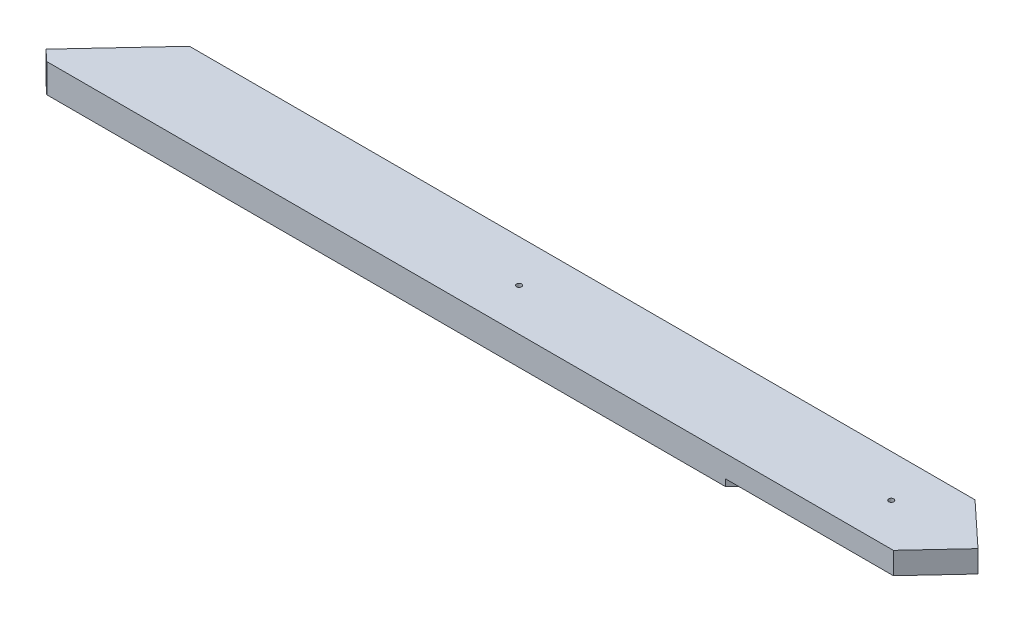
ISO-10303-21;
HEADER;
FILE_DESCRIPTION(('STEP AP214'),'2;1');
FILE_NAME('part.step','',(''),(''),'','','');
FILE_SCHEMA(('AUTOMOTIVE_DESIGN { 1 0 10303 214 1 1 1 1 }'));
ENDSEC;
DATA;
#1=APPLICATION_CONTEXT('core data for automotive mechanical design processes');
#2=APPLICATION_PROTOCOL_DEFINITION('international standard','automotive_design',2000,#1);
#3=PRODUCT_CONTEXT('',#1,'mechanical');
#4=PRODUCT('Part','Part','',(#3));
#5=PRODUCT_RELATED_PRODUCT_CATEGORY('part','',(#4));
#6=PRODUCT_DEFINITION_FORMATION('','',#4);
#7=PRODUCT_DEFINITION_CONTEXT('part definition',#1,'design');
#8=PRODUCT_DEFINITION('design','',#6,#7);
#9=PRODUCT_DEFINITION_SHAPE('','',#8);
#10=(LENGTH_UNIT() NAMED_UNIT(*) SI_UNIT(.MILLI.,.METRE.));
#11=(NAMED_UNIT(*) PLANE_ANGLE_UNIT() SI_UNIT($,.RADIAN.));
#12=(NAMED_UNIT(*) SI_UNIT($,.STERADIAN.) SOLID_ANGLE_UNIT());
#13=UNCERTAINTY_MEASURE_WITH_UNIT(LENGTH_MEASURE(1.E-05),#10,'distance_accuracy_value','');
#14=(GEOMETRIC_REPRESENTATION_CONTEXT(3) GLOBAL_UNCERTAINTY_ASSIGNED_CONTEXT((#13)) GLOBAL_UNIT_ASSIGNED_CONTEXT((#10,
#11,#12)) REPRESENTATION_CONTEXT('',''));
#15=CARTESIAN_POINT('',(0.,0.,0.));
#16=DIRECTION('',(0.,0.,1.));
#17=DIRECTION('',(1.,0.,0.));
#18=AXIS2_PLACEMENT_3D('',#15,#16,#17);
#19=CARTESIAN_POINT('',(440.,0.,0.));
#20=DIRECTION('',(0.,1.,0.));
#21=DIRECTION('',(0.,0.,1.));
#22=AXIS2_PLACEMENT_3D('',#19,#20,#21);
#23=CYLINDRICAL_SURFACE('',#22,3.);
#24=CARTESIAN_POINT('',(440.,34.,0.));
#25=DIRECTION('',(0.,1.,0.));
#26=DIRECTION('',(0.,0.,1.));
#27=AXIS2_PLACEMENT_3D('',#24,#25,#26);
#28=CIRCLE('',#27,3.);
#29=CARTESIAN_POINT('',(440.,34.,3.));
#30=VERTEX_POINT('',#29);
#31=EDGE_CURVE('E133',#30,#30,#28,.T.);
#32=ORIENTED_EDGE('',*,*,#31,.T.);
#33=EDGE_LOOP('',(#32));
#34=FACE_BOUND('',#33,.T.);
#35=CARTESIAN_POINT('',(440.,8.,0.));
#36=DIRECTION('',(0.,-1.,0.));
#37=DIRECTION('',(0.,0.,-1.));
#38=AXIS2_PLACEMENT_3D('',#35,#36,#37);
#39=CIRCLE('',#38,3.);
#40=CARTESIAN_POINT('',(440.,8.,-3.));
#41=VERTEX_POINT('',#40);
#42=EDGE_CURVE('E109',#41,#41,#39,.F.);
#43=ORIENTED_EDGE('',*,*,#42,.F.);
#44=EDGE_LOOP('',(#43));
#45=FACE_BOUND('',#44,.T.);
#46=ADVANCED_FACE('F33',(#34,#45),#23,.F.);
#47=CARTESIAN_POINT('',(394.883300151054,0.,154.73897124015));
#48=DIRECTION('',(-0.731521679065049,0.,-0.681818181818182));
#49=DIRECTION('',(-0.681818181818182,0.,0.731521679065049));
#50=AXIS2_PLACEMENT_3D('',#47,#48,#49);
#51=PLANE('',#50);
#52=DIRECTION('',(-0.681818181818182,0.,0.731521679065049));
#53=VECTOR('',#52,1.);
#54=CARTESIAN_POINT('',(394.883300151054,8.,154.73897124015));
#55=LINE('',#54,#53);
#56=CARTESIAN_POINT('',(540.762594459489,8.,-1.77469935273544));
#57=VERTEX_POINT('',#56);
#58=CARTESIAN_POINT('',(492.505745227101,8.,50.));
#59=VERTEX_POINT('',#58);
#60=EDGE_CURVE('E173',#57,#59,#55,.T.);
#61=ORIENTED_EDGE('',*,*,#60,.F.);
#62=DIRECTION('',(0.,1.,0.));
#63=VECTOR('',#62,1.);
#64=CARTESIAN_POINT('',(540.762594459489,0.,-1.77469935273547));
#65=LINE('',#64,#63);
#66=CARTESIAN_POINT('',(540.762594459489,34.,-1.77469935273547));
#67=VERTEX_POINT('',#66);
#68=EDGE_CURVE('E143',#57,#67,#65,.T.);
#69=ORIENTED_EDGE('',*,*,#68,.T.);
#70=DIRECTION('',(-0.681818181818182,0.,0.731521679065049));
#71=VECTOR('',#70,1.);
#72=CARTESIAN_POINT('',(394.883300151054,34.,154.73897124015));
#73=LINE('',#72,#71);
#74=CARTESIAN_POINT('',(492.505745227101,34.,50.));
#75=VERTEX_POINT('',#74);
#76=EDGE_CURVE('E148',#67,#75,#73,.T.);
#77=ORIENTED_EDGE('',*,*,#76,.T.);
#78=DIRECTION('',(0.,1.,0.));
#79=VECTOR('',#78,1.);
#80=CARTESIAN_POINT('',(492.505745227102,34.,50.));
#81=LINE('',#80,#79);
#82=EDGE_CURVE('E138',#59,#75,#81,.T.);
#83=ORIENTED_EDGE('',*,*,#82,.F.);
#84=EDGE_LOOP('',(#61,#69,#77,#83));
#85=FACE_BOUND('',#84,.T.);
#86=ADVANCED_FACE('F189',(#85),#51,.F.);
#87=CARTESIAN_POINT('',(540.762594459489,0.,-1.77469935273547));
#88=DIRECTION('',(-0.681818181818181,0.,0.73152167906505));
#89=DIRECTION('',(0.73152167906505,0.,0.681818181818181));
#90=AXIS2_PLACEMENT_3D('',#87,#88,#89);
#91=PLANE('',#90);
#92=DIRECTION('',(0.73152167906505,0.,0.681818181818181));
#93=VECTOR('',#92,1.);
#94=CARTESIAN_POINT('',(540.762594459489,8.,-1.77469935273547));
#95=LINE('',#94,#93);
#96=CARTESIAN_POINT('',(489.02174353523,8.,-50.));
#97=VERTEX_POINT('',#96);
#98=EDGE_CURVE('E11',#97,#57,#95,.T.);
#99=ORIENTED_EDGE('',*,*,#98,.F.);
#100=DIRECTION('',(0.,-1.,0.));
#101=VECTOR('',#100,1.);
#102=CARTESIAN_POINT('',(489.02174353523,34.,-50.));
#103=LINE('',#102,#101);
#104=CARTESIAN_POINT('',(489.02174353523,34.,-50.));
#105=VERTEX_POINT('',#104);
#106=EDGE_CURVE('E140',#105,#97,#103,.T.);
#107=ORIENTED_EDGE('',*,*,#106,.F.);
#108=DIRECTION('',(0.73152167906505,0.,0.681818181818181));
#109=VECTOR('',#108,1.);
#110=CARTESIAN_POINT('',(540.762594459489,34.,-1.77469935273547));
#111=LINE('',#110,#109);
#112=EDGE_CURVE('E145',#105,#67,#111,.T.);
#113=ORIENTED_EDGE('',*,*,#112,.T.);
#114=ORIENTED_EDGE('',*,*,#68,.F.);
#115=EDGE_LOOP('',(#99,#107,#113,#114));
#116=FACE_BOUND('',#115,.T.);
#117=ADVANCED_FACE('F180',(#116),#91,.F.);
#118=CARTESIAN_POINT('',(-550.,34.,-50.));
#119=DIRECTION('',(0.,0.,1.));
#120=DIRECTION('',(1.,0.,0.));
#121=AXIS2_PLACEMENT_3D('',#118,#119,#120);
#122=PLANE('',#121);
#123=DIRECTION('',(1.,0.,0.));
#124=VECTOR('',#123,1.);
#125=CARTESIAN_POINT('',(-550.,8.,-50.));
#126=LINE('',#125,#124);
#127=CARTESIAN_POINT('',(387.494254772899,8.,-50.));
#128=VERTEX_POINT('',#127);
#129=EDGE_CURVE('E47',#128,#97,#126,.T.);
#130=ORIENTED_EDGE('',*,*,#129,.F.);
#131=DIRECTION('',(0.,-1.,0.));
#132=VECTOR('',#131,1.);
#133=CARTESIAN_POINT('',(387.494254772899,34.,-50.));
#134=LINE('',#133,#132);
#135=CARTESIAN_POINT('',(387.494254772899,0.,-50.));
#136=VERTEX_POINT('',#135);
#137=EDGE_CURVE('E108',#128,#136,#134,.T.);
#138=ORIENTED_EDGE('',*,*,#137,.T.);
#139=DIRECTION('',(-1.,0.,0.));
#140=VECTOR('',#139,1.);
#141=CARTESIAN_POINT('',(-550.,0.,-50.));
#142=LINE('',#141,#140);
#143=CARTESIAN_POINT('',(-439.548903774699,0.,-50.));
#144=VERTEX_POINT('',#143);
#145=EDGE_CURVE('E55',#136,#144,#142,.T.);
#146=ORIENTED_EDGE('',*,*,#145,.T.);
#147=DIRECTION('',(0.,-1.,0.));
#148=VECTOR('',#147,1.);
#149=CARTESIAN_POINT('',(-439.548903774699,34.,-50.));
#150=LINE('',#149,#148);
#151=CARTESIAN_POINT('',(-439.548903774699,34.,-50.));
#152=VERTEX_POINT('',#151);
#153=EDGE_CURVE('E153',#152,#144,#150,.T.);
#154=ORIENTED_EDGE('',*,*,#153,.F.);
#155=DIRECTION('',(-1.,0.,0.));
#156=VECTOR('',#155,1.);
#157=CARTESIAN_POINT('',(-550.,34.,-50.));
#158=LINE('',#157,#156);
#159=EDGE_CURVE('E122',#105,#152,#158,.T.);
#160=ORIENTED_EDGE('',*,*,#159,.F.);
#161=ORIENTED_EDGE('',*,*,#106,.T.);
#162=EDGE_LOOP('',(#130,#138,#146,#154,#160,#161));
#163=FACE_BOUND('',#162,.T.);
#164=ADVANCED_FACE('F35',(#163),#122,.F.);
#165=CARTESIAN_POINT('',(-550.,34.,50.));
#166=DIRECTION('',(0.,0.,-1.));
#167=DIRECTION('',(-1.,0.,0.));
#168=AXIS2_PLACEMENT_3D('',#165,#166,#167);
#169=PLANE('',#168);
#170=DIRECTION('',(1.,0.,0.));
#171=VECTOR('',#170,1.);
#172=CARTESIAN_POINT('',(-550.,0.,50.));
#173=LINE('',#172,#171);
#174=CARTESIAN_POINT('',(-508.259057511825,0.,50.));
#175=VERTEX_POINT('',#174);
#176=CARTESIAN_POINT('',(294.288789872718,0.,50.));
#177=VERTEX_POINT('',#176);
#178=EDGE_CURVE('E115',#175,#177,#173,.T.);
#179=ORIENTED_EDGE('',*,*,#178,.T.);
#180=DIRECTION('',(0.,1.,0.));
#181=VECTOR('',#180,1.);
#182=CARTESIAN_POINT('',(294.288789872719,34.,50.));
#183=LINE('',#182,#181);
#184=CARTESIAN_POINT('',(294.288789872718,8.,50.));
#185=VERTEX_POINT('',#184);
#186=EDGE_CURVE('E100',#177,#185,#183,.T.);
#187=ORIENTED_EDGE('',*,*,#186,.T.);
#188=DIRECTION('',(-1.,0.,0.));
#189=VECTOR('',#188,1.);
#190=CARTESIAN_POINT('',(-550.,8.,50.));
#191=LINE('',#190,#189);
#192=EDGE_CURVE('E171',#59,#185,#191,.T.);
#193=ORIENTED_EDGE('',*,*,#192,.F.);
#194=ORIENTED_EDGE('',*,*,#82,.T.);
#195=DIRECTION('',(1.,0.,0.));
#196=VECTOR('',#195,1.);
#197=CARTESIAN_POINT('',(-550.,34.,50.));
#198=LINE('',#197,#196);
#199=CARTESIAN_POINT('',(-508.259057511825,34.,50.));
#200=VERTEX_POINT('',#199);
#201=EDGE_CURVE('E41',#200,#75,#198,.T.);
#202=ORIENTED_EDGE('',*,*,#201,.F.);
#203=DIRECTION('',(0.,-1.,0.));
#204=VECTOR('',#203,1.);
#205=CARTESIAN_POINT('',(-508.259057511825,34.,50.));
#206=LINE('',#205,#204);
#207=EDGE_CURVE('E121',#200,#175,#206,.T.);
#208=ORIENTED_EDGE('',*,*,#207,.T.);
#209=EDGE_LOOP('',(#179,#187,#193,#194,#202,#208));
#210=FACE_BOUND('',#209,.T.);
#211=ADVANCED_FACE('F119',(#210),#169,.F.);
#212=CARTESIAN_POINT('',(0.,34.,0.));
#213=DIRECTION('',(0.,1.,0.));
#214=DIRECTION('',(0.,0.,1.));
#215=AXIS2_PLACEMENT_3D('',#212,#213,#214);
#216=PLANE('',#215);
#217=DIRECTION('',(0.731521679065048,0.,0.681818181818183));
#218=VECTOR('',#217,1.);
#219=CARTESIAN_POINT('',(-521.367085592881,34.,37.7826014878059));
#220=LINE('',#219,#218);
#221=CARTESIAN_POINT('',(-521.367085592881,34.,37.7826014878059));
#222=VERTEX_POINT('',#221);
#223=EDGE_CURVE('E155',#222,#200,#220,.T.);
#224=ORIENTED_EDGE('',*,*,#223,.T.);
#225=ORIENTED_EDGE('',*,*,#201,.T.);
#226=ORIENTED_EDGE('',*,*,#76,.F.);
#227=ORIENTED_EDGE('',*,*,#112,.F.);
#228=ORIENTED_EDGE('',*,*,#159,.T.);
#229=DIRECTION('',(-0.681818181818182,0.,0.731521679065049));
#230=VECTOR('',#229,1.);
#231=CARTESIAN_POINT('',(-439.548903774699,34.,-50.));
#232=LINE('',#231,#230);
#233=EDGE_CURVE('E159',#152,#222,#232,.T.);
#234=ORIENTED_EDGE('',*,*,#233,.T.);
#235=EDGE_LOOP('',(#224,#225,#226,#227,#228,#234));
#236=FACE_BOUND('',#235,.T.);
#237=ORIENTED_EDGE('',*,*,#31,.F.);
#238=EDGE_LOOP('',(#237));
#239=FACE_BOUND('',#238,.T.);
#240=CARTESIAN_POINT('',(0.,34.,0.));
#241=DIRECTION('',(0.,1.,0.));
#242=DIRECTION('',(0.,0.,1.));
#243=AXIS2_PLACEMENT_3D('',#240,#241,#242);
#244=CIRCLE('',#243,3.);
#245=CARTESIAN_POINT('',(0.,34.,3.));
#246=VERTEX_POINT('',#245);
#247=EDGE_CURVE('E130',#246,#246,#244,.T.);
#248=ORIENTED_EDGE('',*,*,#247,.F.);
#249=EDGE_LOOP('',(#248));
#250=FACE_BOUND('',#249,.T.);
#251=ADVANCED_FACE('F184',(#236,#239,#250),#216,.T.);
#252=CARTESIAN_POINT('',(0.,0.,0.));
#253=DIRECTION('',(0.,1.,0.));
#254=DIRECTION('',(0.,0.,1.));
#255=AXIS2_PLACEMENT_3D('',#252,#253,#254);
#256=PLANE('',#255);
#257=CARTESIAN_POINT('',(0.,0.,0.));
#258=DIRECTION('',(0.,1.,0.));
#259=DIRECTION('',(0.,0.,1.));
#260=AXIS2_PLACEMENT_3D('',#257,#258,#259);
#261=CIRCLE('',#260,3.);
#262=CARTESIAN_POINT('',(0.,0.,3.));
#263=VERTEX_POINT('',#262);
#264=EDGE_CURVE('E125',#263,#263,#261,.T.);
#265=ORIENTED_EDGE('',*,*,#264,.T.);
#266=EDGE_LOOP('',(#265));
#267=FACE_BOUND('',#266,.T.);
#268=ORIENTED_EDGE('',*,*,#145,.F.);
#269=DIRECTION('',(0.681818181818182,0.,-0.731521679065049));
#270=VECTOR('',#269,1.);
#271=CARTESIAN_POINT('',(457.659075479897,0.,-125.27972826716));
#272=LINE('',#271,#270);
#273=EDGE_CURVE('E103',#177,#136,#272,.T.);
#274=ORIENTED_EDGE('',*,*,#273,.F.);
#275=ORIENTED_EDGE('',*,*,#178,.F.);
#276=DIRECTION('',(0.731521679065048,0.,0.681818181818183));
#277=VECTOR('',#276,1.);
#278=CARTESIAN_POINT('',(-521.367085592881,0.,37.7826014878059));
#279=LINE('',#278,#277);
#280=CARTESIAN_POINT('',(-521.367085592881,0.,37.7826014878059));
#281=VERTEX_POINT('',#280);
#282=EDGE_CURVE('E157',#281,#175,#279,.T.);
#283=ORIENTED_EDGE('',*,*,#282,.F.);
#284=DIRECTION('',(-0.681818181818182,0.,0.731521679065049));
#285=VECTOR('',#284,1.);
#286=CARTESIAN_POINT('',(-439.548903774699,0.,-50.));
#287=LINE('',#286,#285);
#288=EDGE_CURVE('E160',#144,#281,#287,.T.);
#289=ORIENTED_EDGE('',*,*,#288,.F.);
#290=EDGE_LOOP('',(#268,#274,#275,#283,#289));
#291=FACE_BOUND('',#290,.T.);
#292=ADVANCED_FACE('F113',(#267,#291),#256,.F.);
#293=CARTESIAN_POINT('',(0.,0.,0.));
#294=DIRECTION('',(0.,1.,0.));
#295=DIRECTION('',(0.,0.,1.));
#296=AXIS2_PLACEMENT_3D('',#293,#294,#295);
#297=CYLINDRICAL_SURFACE('',#296,3.);
#298=ORIENTED_EDGE('',*,*,#264,.F.);
#299=EDGE_LOOP('',(#298));
#300=FACE_BOUND('',#299,.T.);
#301=ORIENTED_EDGE('',*,*,#247,.T.);
#302=EDGE_LOOP('',(#301));
#303=FACE_BOUND('',#302,.T.);
#304=ADVANCED_FACE('F201',(#300,#303),#297,.F.);
#305=CARTESIAN_POINT('',(-521.367085592881,34.,37.7826014878059));
#306=DIRECTION('',(0.681818181818183,0.,-0.731521679065048));
#307=DIRECTION('',(-0.731521679065048,0.,-0.681818181818183));
#308=AXIS2_PLACEMENT_3D('',#305,#306,#307);
#309=PLANE('',#308);
#310=ORIENTED_EDGE('',*,*,#223,.F.);
#311=DIRECTION('',(0.,-1.,0.));
#312=VECTOR('',#311,1.);
#313=CARTESIAN_POINT('',(-521.367085592881,34.,37.7826014878059));
#314=LINE('',#313,#312);
#315=EDGE_CURVE('E152',#222,#281,#314,.T.);
#316=ORIENTED_EDGE('',*,*,#315,.T.);
#317=ORIENTED_EDGE('',*,*,#282,.T.);
#318=ORIENTED_EDGE('',*,*,#207,.F.);
#319=EDGE_LOOP('',(#310,#316,#317,#318));
#320=FACE_BOUND('',#319,.T.);
#321=ADVANCED_FACE('F204',(#320),#309,.F.);
#322=CARTESIAN_POINT('',(-439.548903774699,34.,-50.));
#323=DIRECTION('',(0.731521679065049,0.,0.681818181818182));
#324=DIRECTION('',(0.681818181818182,0.,-0.731521679065049));
#325=AXIS2_PLACEMENT_3D('',#322,#323,#324);
#326=PLANE('',#325);
#327=ORIENTED_EDGE('',*,*,#288,.T.);
#328=ORIENTED_EDGE('',*,*,#315,.F.);
#329=ORIENTED_EDGE('',*,*,#233,.F.);
#330=ORIENTED_EDGE('',*,*,#153,.T.);
#331=EDGE_LOOP('',(#327,#328,#329,#330));
#332=FACE_BOUND('',#331,.T.);
#333=ADVANCED_FACE('F237',(#332),#326,.F.);
#334=CARTESIAN_POINT('',(457.659075479897,8.,-125.27972826716));
#335=DIRECTION('',(-0.731521679065049,0.,-0.681818181818182));
#336=DIRECTION('',(-0.681818181818182,0.,0.731521679065049));
#337=AXIS2_PLACEMENT_3D('',#334,#335,#336);
#338=PLANE('',#337);
#339=DIRECTION('',(0.681818181818182,0.,-0.731521679065049));
#340=VECTOR('',#339,1.);
#341=CARTESIAN_POINT('',(457.659075479897,8.,-125.27972826716));
#342=LINE('',#341,#340);
#343=EDGE_CURVE('E104',#185,#128,#342,.T.);
#344=ORIENTED_EDGE('',*,*,#343,.F.);
#345=ORIENTED_EDGE('',*,*,#186,.F.);
#346=ORIENTED_EDGE('',*,*,#273,.T.);
#347=ORIENTED_EDGE('',*,*,#137,.F.);
#348=EDGE_LOOP('',(#344,#345,#346,#347));
#349=FACE_BOUND('',#348,.T.);
#350=ADVANCED_FACE('F102',(#349),#338,.F.);
#351=CARTESIAN_POINT('',(0.,8.,0.));
#352=DIRECTION('',(0.,-1.,0.));
#353=DIRECTION('',(0.,0.,-1.));
#354=AXIS2_PLACEMENT_3D('',#351,#352,#353);
#355=PLANE('',#354);
#356=ORIENTED_EDGE('',*,*,#129,.T.);
#357=ORIENTED_EDGE('',*,*,#98,.T.);
#358=ORIENTED_EDGE('',*,*,#60,.T.);
#359=ORIENTED_EDGE('',*,*,#192,.T.);
#360=ORIENTED_EDGE('',*,*,#343,.T.);
#361=EDGE_LOOP('',(#356,#357,#358,#359,#360));
#362=FACE_BOUND('',#361,.T.);
#363=ORIENTED_EDGE('',*,*,#42,.T.);
#364=EDGE_LOOP('',(#363));
#365=FACE_BOUND('',#364,.T.);
#366=ADVANCED_FACE('F175',(#362,#365),#355,.T.);
#367=CLOSED_SHELL('',(#46,#86,#117,#164,#211,#251,#292,#304,#321,#333,#350,#366));
#368=MANIFOLD_SOLID_BREP('B2',#367);
#369=ADVANCED_BREP_SHAPE_REPRESENTATION('',(#18,#368),#14);
#370=SHAPE_DEFINITION_REPRESENTATION(#9,#369);
ENDSEC;
END-ISO-10303-21;
